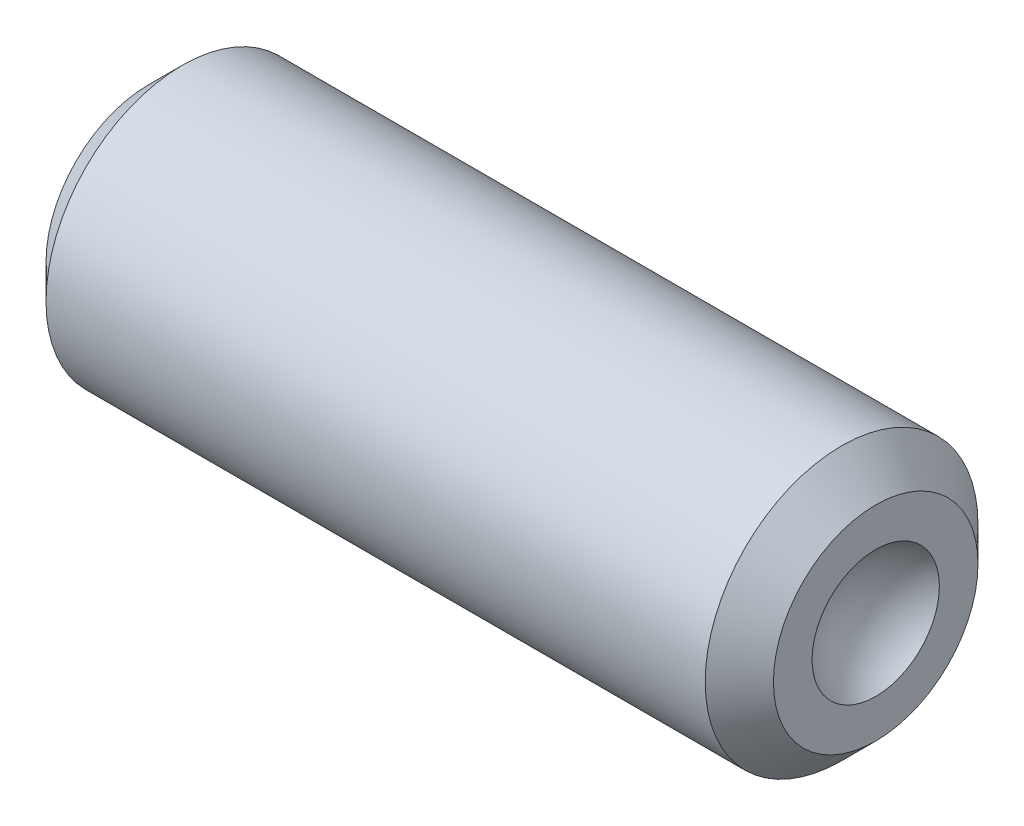
ISO-10303-21;
HEADER;
FILE_DESCRIPTION(('STEP AP214'),'2;1');
FILE_NAME('part.step','',(''),(''),'','','');
FILE_SCHEMA(('AUTOMOTIVE_DESIGN { 1 0 10303 214 1 1 1 1 }'));
ENDSEC;
DATA;
#1=APPLICATION_CONTEXT('core data for automotive mechanical design processes');
#2=APPLICATION_PROTOCOL_DEFINITION('international standard','automotive_design',2000,#1);
#3=PRODUCT_CONTEXT('',#1,'mechanical');
#4=PRODUCT('Part','Part','',(#3));
#5=PRODUCT_RELATED_PRODUCT_CATEGORY('part','',(#4));
#6=PRODUCT_DEFINITION_FORMATION('','',#4);
#7=PRODUCT_DEFINITION_CONTEXT('part definition',#1,'design');
#8=PRODUCT_DEFINITION('design','',#6,#7);
#9=PRODUCT_DEFINITION_SHAPE('','',#8);
#10=(LENGTH_UNIT() NAMED_UNIT(*) SI_UNIT(.MILLI.,.METRE.));
#11=(NAMED_UNIT(*) PLANE_ANGLE_UNIT() SI_UNIT($,.RADIAN.));
#12=(NAMED_UNIT(*) SI_UNIT($,.STERADIAN.) SOLID_ANGLE_UNIT());
#13=UNCERTAINTY_MEASURE_WITH_UNIT(LENGTH_MEASURE(1.E-05),#10,'distance_accuracy_value','');
#14=(GEOMETRIC_REPRESENTATION_CONTEXT(3) GLOBAL_UNCERTAINTY_ASSIGNED_CONTEXT((#13)) GLOBAL_UNIT_ASSIGNED_CONTEXT((#10,
#11,#12)) REPRESENTATION_CONTEXT('',''));
#15=CARTESIAN_POINT('',(0.,0.,0.));
#16=DIRECTION('',(0.,0.,1.));
#17=DIRECTION('',(1.,0.,0.));
#18=AXIS2_PLACEMENT_3D('',#15,#16,#17);
#19=CARTESIAN_POINT('',(0.,0.,0.));
#20=DIRECTION('',(1.,0.,0.));
#21=DIRECTION('',(0.,1.,0.));
#22=AXIS2_PLACEMENT_3D('',#19,#20,#21);
#23=PLANE('',#22);
#24=DIRECTION('',(0.,-0.5,-0.866025403784439));
#25=VECTOR('',#24,1.);
#26=CARTESIAN_POINT('',(0.,0.866025403784439,0.));
#27=LINE('',#26,#25);
#28=CARTESIAN_POINT('',(0.,0.866025403784439,0.));
#29=VERTEX_POINT('',#28);
#30=CARTESIAN_POINT('',(0.,0.43301270189222,-0.75));
#31=VERTEX_POINT('',#30);
#32=EDGE_CURVE('E107',#29,#31,#27,.T.);
#33=ORIENTED_EDGE('',*,*,#32,.F.);
#34=DIRECTION('',(0.,0.5,-0.866025403784439));
#35=VECTOR('',#34,1.);
#36=CARTESIAN_POINT('',(0.,0.433012701892219,0.75));
#37=LINE('',#36,#35);
#38=CARTESIAN_POINT('',(0.,0.433012701892219,0.75));
#39=VERTEX_POINT('',#38);
#40=EDGE_CURVE('E49',#39,#29,#37,.T.);
#41=ORIENTED_EDGE('',*,*,#40,.F.);
#42=DIRECTION('',(0.,1.,0.));
#43=VECTOR('',#42,1.);
#44=CARTESIAN_POINT('',(0.,-0.43301270189222,0.75));
#45=LINE('',#44,#43);
#46=CARTESIAN_POINT('',(0.,-0.43301270189222,0.75));
#47=VERTEX_POINT('',#46);
#48=EDGE_CURVE('E122',#47,#39,#45,.T.);
#49=ORIENTED_EDGE('',*,*,#48,.F.);
#50=DIRECTION('',(0.,0.5,0.866025403784439));
#51=VECTOR('',#50,1.);
#52=CARTESIAN_POINT('',(0.,-0.866025403784439,0.));
#53=LINE('',#52,#51);
#54=CARTESIAN_POINT('',(0.,-0.866025403784439,0.));
#55=VERTEX_POINT('',#54);
#56=EDGE_CURVE('E116',#55,#47,#53,.T.);
#57=ORIENTED_EDGE('',*,*,#56,.F.);
#58=DIRECTION('',(0.,-0.5,0.866025403784439));
#59=VECTOR('',#58,1.);
#60=CARTESIAN_POINT('',(0.,-0.433012701892219,-0.75));
#61=LINE('',#60,#59);
#62=CARTESIAN_POINT('',(0.,-0.433012701892219,-0.75));
#63=VERTEX_POINT('',#62);
#64=EDGE_CURVE('E114',#63,#55,#61,.T.);
#65=ORIENTED_EDGE('',*,*,#64,.F.);
#66=DIRECTION('',(0.,-1.,0.));
#67=VECTOR('',#66,1.);
#68=CARTESIAN_POINT('',(0.,0.43301270189222,-0.75));
#69=LINE('',#68,#67);
#70=EDGE_CURVE('E100',#31,#63,#69,.T.);
#71=ORIENTED_EDGE('',*,*,#70,.F.);
#72=EDGE_LOOP('',(#33,#41,#49,#57,#65,#71));
#73=FACE_BOUND('',#72,.T.);
#74=CARTESIAN_POINT('',(0.,0.,0.));
#75=DIRECTION('',(-1.,0.,0.));
#76=DIRECTION('',(0.,-1.,0.));
#77=AXIS2_PLACEMENT_3D('',#74,#75,#76);
#78=CIRCLE('',#77,1.125);
#79=CARTESIAN_POINT('',(0.,-1.125,0.));
#80=VERTEX_POINT('',#79);
#81=EDGE_CURVE('E12',#80,#80,#78,.T.);
#82=ORIENTED_EDGE('',*,*,#81,.T.);
#83=EDGE_LOOP('',(#82));
#84=FACE_BOUND('',#83,.T.);
#85=ADVANCED_FACE('F35',(#73,#84),#23,.F.);
#86=CARTESIAN_POINT('',(0.375000000000001,0.,0.));
#87=DIRECTION('',(1.,0.,0.));
#88=DIRECTION('',(0.,1.,0.));
#89=AXIS2_PLACEMENT_3D('',#86,#87,#88);
#90=CONICAL_SURFACE('',#89,1.5,0.785398163397447);
#91=ORIENTED_EDGE('',*,*,#81,.F.);
#92=EDGE_LOOP('',(#91));
#93=FACE_BOUND('',#92,.T.);
#94=CARTESIAN_POINT('',(0.375000000000001,0.,0.));
#95=DIRECTION('',(-1.,0.,0.));
#96=DIRECTION('',(0.,-1.,0.));
#97=AXIS2_PLACEMENT_3D('',#94,#95,#96);
#98=CIRCLE('',#97,1.5);
#99=CARTESIAN_POINT('',(0.375000000000001,-1.5,0.));
#100=VERTEX_POINT('',#99);
#101=EDGE_CURVE('E42',#100,#100,#98,.T.);
#102=ORIENTED_EDGE('',*,*,#101,.T.);
#103=EDGE_LOOP('',(#102));
#104=FACE_BOUND('',#103,.T.);
#105=ADVANCED_FACE('F145',(#93,#104),#90,.T.);
#106=CARTESIAN_POINT('',(0.,0.,0.));
#107=DIRECTION('',(-1.,0.,0.));
#108=DIRECTION('',(0.,-1.,0.));
#109=AXIS2_PLACEMENT_3D('',#106,#107,#108);
#110=CYLINDRICAL_SURFACE('',#109,1.5);
#111=ORIENTED_EDGE('',*,*,#101,.F.);
#112=EDGE_LOOP('',(#111));
#113=FACE_BOUND('',#112,.T.);
#114=CARTESIAN_POINT('',(7.625,0.,0.));
#115=DIRECTION('',(-1.,0.,0.));
#116=DIRECTION('',(0.,-1.,0.));
#117=AXIS2_PLACEMENT_3D('',#114,#115,#116);
#118=CIRCLE('',#117,1.5);
#119=CARTESIAN_POINT('',(7.625,-1.5,0.));
#120=VERTEX_POINT('',#119);
#121=EDGE_CURVE('E140',#120,#120,#118,.T.);
#122=ORIENTED_EDGE('',*,*,#121,.T.);
#123=EDGE_LOOP('',(#122));
#124=FACE_BOUND('',#123,.T.);
#125=ADVANCED_FACE('F147',(#113,#124),#110,.T.);
#126=CARTESIAN_POINT('',(8.,0.,0.));
#127=DIRECTION('',(-1.,0.,0.));
#128=DIRECTION('',(0.,-1.,0.));
#129=AXIS2_PLACEMENT_3D('',#126,#127,#128);
#130=CONICAL_SURFACE('',#129,1.125,0.78539816339745);
#131=ORIENTED_EDGE('',*,*,#121,.F.);
#132=EDGE_LOOP('',(#131));
#133=FACE_BOUND('',#132,.T.);
#134=CARTESIAN_POINT('',(8.,0.,0.));
#135=DIRECTION('',(-1.,0.,0.));
#136=DIRECTION('',(0.,-1.,0.));
#137=AXIS2_PLACEMENT_3D('',#134,#135,#136);
#138=CIRCLE('',#137,1.125);
#139=CARTESIAN_POINT('',(8.,-1.125,0.));
#140=VERTEX_POINT('',#139);
#141=EDGE_CURVE('E137',#140,#140,#138,.T.);
#142=ORIENTED_EDGE('',*,*,#141,.T.);
#143=EDGE_LOOP('',(#142));
#144=FACE_BOUND('',#143,.T.);
#145=ADVANCED_FACE('F150',(#133,#144),#130,.T.);
#146=CARTESIAN_POINT('',(8.,1.125,0.));
#147=DIRECTION('',(-1.,0.,0.));
#148=DIRECTION('',(0.,-1.,0.));
#149=AXIS2_PLACEMENT_3D('',#146,#147,#148);
#150=PLANE('',#149);
#151=ORIENTED_EDGE('',*,*,#141,.F.);
#152=EDGE_LOOP('',(#151));
#153=FACE_BOUND('',#152,.T.);
#154=CARTESIAN_POINT('',(8.,0.,0.));
#155=DIRECTION('',(-1.,0.,0.));
#156=DIRECTION('',(0.,-1.,0.));
#157=AXIS2_PLACEMENT_3D('',#154,#155,#156);
#158=CIRCLE('',#157,0.7);
#159=CARTESIAN_POINT('',(8.,-0.7,0.));
#160=VERTEX_POINT('',#159);
#161=EDGE_CURVE('E134',#160,#160,#158,.T.);
#162=ORIENTED_EDGE('',*,*,#161,.T.);
#163=EDGE_LOOP('',(#162));
#164=FACE_BOUND('',#163,.T.);
#165=ADVANCED_FACE('F156',(#153,#164),#150,.F.);
#166=CARTESIAN_POINT('',(8.46583333333333,0.,0.));
#167=DIRECTION('',(-1.,0.,0.));
#168=DIRECTION('',(0.,-1.,0.));
#169=AXIS2_PLACEMENT_3D('',#166,#167,#168);
#170=SPHERICAL_SURFACE('',#169,0.840833333333333);
#171=ORIENTED_EDGE('',*,*,#161,.F.);
#172=EDGE_LOOP('',(#171));
#173=FACE_BOUND('',#172,.T.);
#174=ADVANCED_FACE('F162',(#173),#170,.F.);
#175=CARTESIAN_POINT('',(10.2912878474779,0.433012701892219,0.75));
#176=DIRECTION('',(0.,0.866025403784438,0.5));
#177=DIRECTION('',(0.,-0.5,0.866025403784439));
#178=AXIS2_PLACEMENT_3D('',#175,#176,#177);
#179=PLANE('',#178);
#180=DIRECTION('',(0.,-0.5,0.866025403784439));
#181=VECTOR('',#180,1.);
#182=CARTESIAN_POINT('',(6.,0.433012701892219,0.75));
#183=LINE('',#182,#181);
#184=CARTESIAN_POINT('',(6.,0.866025403784439,0.));
#185=VERTEX_POINT('',#184);
#186=CARTESIAN_POINT('',(6.,0.433012701892219,0.75));
#187=VERTEX_POINT('',#186);
#188=EDGE_CURVE('E68',#185,#187,#183,.T.);
#189=ORIENTED_EDGE('',*,*,#188,.T.);
#190=DIRECTION('',(-1.,0.,0.));
#191=VECTOR('',#190,1.);
#192=CARTESIAN_POINT('',(10.2912878474779,0.433012701892219,0.75));
#193=LINE('',#192,#191);
#194=EDGE_CURVE('E125',#187,#39,#193,.T.);
#195=ORIENTED_EDGE('',*,*,#194,.T.);
#196=ORIENTED_EDGE('',*,*,#40,.T.);
#197=DIRECTION('',(-1.,0.,0.));
#198=VECTOR('',#197,1.);
#199=CARTESIAN_POINT('',(10.2912878474779,0.866025403784439,0.));
#200=LINE('',#199,#198);
#201=EDGE_CURVE('E104',#185,#29,#200,.T.);
#202=ORIENTED_EDGE('',*,*,#201,.F.);
#203=EDGE_LOOP('',(#189,#195,#196,#202));
#204=FACE_BOUND('',#203,.T.);
#205=ADVANCED_FACE('F167',(#204),#179,.F.);
#206=CARTESIAN_POINT('',(10.2912878474779,-0.43301270189222,0.75));
#207=DIRECTION('',(0.,0.,1.));
#208=DIRECTION('',(0.,-1.,0.));
#209=AXIS2_PLACEMENT_3D('',#206,#207,#208);
#210=PLANE('',#209);
#211=DIRECTION('',(0.,-1.,0.));
#212=VECTOR('',#211,1.);
#213=CARTESIAN_POINT('',(6.,-0.43301270189222,0.75));
#214=LINE('',#213,#212);
#215=CARTESIAN_POINT('',(6.,-0.43301270189222,0.75));
#216=VERTEX_POINT('',#215);
#217=EDGE_CURVE('E267',#187,#216,#214,.T.);
#218=ORIENTED_EDGE('',*,*,#217,.T.);
#219=DIRECTION('',(-1.,0.,0.));
#220=VECTOR('',#219,1.);
#221=CARTESIAN_POINT('',(10.2912878474779,-0.43301270189222,0.75));
#222=LINE('',#221,#220);
#223=EDGE_CURVE('E127',#216,#47,#222,.T.);
#224=ORIENTED_EDGE('',*,*,#223,.T.);
#225=ORIENTED_EDGE('',*,*,#48,.T.);
#226=ORIENTED_EDGE('',*,*,#194,.F.);
#227=EDGE_LOOP('',(#218,#224,#225,#226));
#228=FACE_BOUND('',#227,.T.);
#229=ADVANCED_FACE('F172',(#228),#210,.F.);
#230=CARTESIAN_POINT('',(10.2912878474779,-0.866025403784439,0.));
#231=DIRECTION('',(0.,-0.866025403784439,0.5));
#232=DIRECTION('',(0.,-0.5,-0.866025403784439));
#233=AXIS2_PLACEMENT_3D('',#230,#231,#232);
#234=PLANE('',#233);
#235=DIRECTION('',(0.,-0.5,-0.866025403784439));
#236=VECTOR('',#235,1.);
#237=CARTESIAN_POINT('',(6.,-0.866025403784439,0.));
#238=LINE('',#237,#236);
#239=CARTESIAN_POINT('',(6.,-0.866025403784439,0.));
#240=VERTEX_POINT('',#239);
#241=EDGE_CURVE('E270',#216,#240,#238,.T.);
#242=ORIENTED_EDGE('',*,*,#241,.T.);
#243=DIRECTION('',(-1.,0.,0.));
#244=VECTOR('',#243,1.);
#245=CARTESIAN_POINT('',(10.2912878474779,-0.866025403784439,0.));
#246=LINE('',#245,#244);
#247=EDGE_CURVE('E129',#240,#55,#246,.T.);
#248=ORIENTED_EDGE('',*,*,#247,.T.);
#249=ORIENTED_EDGE('',*,*,#56,.T.);
#250=ORIENTED_EDGE('',*,*,#223,.F.);
#251=EDGE_LOOP('',(#242,#248,#249,#250));
#252=FACE_BOUND('',#251,.T.);
#253=ADVANCED_FACE('F217',(#252),#234,.F.);
#254=CARTESIAN_POINT('',(10.2912878474779,-0.433012701892219,-0.75));
#255=DIRECTION('',(0.,-0.866025403784439,-0.5));
#256=DIRECTION('',(0.,0.5,-0.866025403784439));
#257=AXIS2_PLACEMENT_3D('',#254,#255,#256);
#258=PLANE('',#257);
#259=DIRECTION('',(0.,0.5,-0.866025403784439));
#260=VECTOR('',#259,1.);
#261=CARTESIAN_POINT('',(6.,-0.433012701892219,-0.75));
#262=LINE('',#261,#260);
#263=CARTESIAN_POINT('',(6.,-0.433012701892219,-0.75));
#264=VERTEX_POINT('',#263);
#265=EDGE_CURVE('E58',#240,#264,#262,.T.);
#266=ORIENTED_EDGE('',*,*,#265,.T.);
#267=DIRECTION('',(-1.,0.,0.));
#268=VECTOR('',#267,1.);
#269=CARTESIAN_POINT('',(10.2912878474779,-0.433012701892219,-0.75));
#270=LINE('',#269,#268);
#271=EDGE_CURVE('E103',#264,#63,#270,.T.);
#272=ORIENTED_EDGE('',*,*,#271,.T.);
#273=ORIENTED_EDGE('',*,*,#64,.T.);
#274=ORIENTED_EDGE('',*,*,#247,.F.);
#275=EDGE_LOOP('',(#266,#272,#273,#274));
#276=FACE_BOUND('',#275,.T.);
#277=ADVANCED_FACE('F227',(#276),#258,.F.);
#278=CARTESIAN_POINT('',(10.2912878474779,0.43301270189222,-0.75));
#279=DIRECTION('',(0.,0.,-1.));
#280=DIRECTION('',(-1.,0.,0.));
#281=AXIS2_PLACEMENT_3D('',#278,#279,#280);
#282=PLANE('',#281);
#283=DIRECTION('',(0.,1.,0.));
#284=VECTOR('',#283,1.);
#285=CARTESIAN_POINT('',(6.,0.43301270189222,-0.75));
#286=LINE('',#285,#284);
#287=CARTESIAN_POINT('',(6.,0.43301270189222,-0.75));
#288=VERTEX_POINT('',#287);
#289=EDGE_CURVE('E102',#264,#288,#286,.T.);
#290=ORIENTED_EDGE('',*,*,#289,.T.);
#291=DIRECTION('',(-1.,0.,0.));
#292=VECTOR('',#291,1.);
#293=CARTESIAN_POINT('',(10.2912878474779,0.43301270189222,-0.75));
#294=LINE('',#293,#292);
#295=EDGE_CURVE('E95',#288,#31,#294,.T.);
#296=ORIENTED_EDGE('',*,*,#295,.T.);
#297=ORIENTED_EDGE('',*,*,#70,.T.);
#298=ORIENTED_EDGE('',*,*,#271,.F.);
#299=EDGE_LOOP('',(#290,#296,#297,#298));
#300=FACE_BOUND('',#299,.T.);
#301=ADVANCED_FACE('F97',(#300),#282,.F.);
#302=CARTESIAN_POINT('',(10.2912878474779,0.866025403784439,0.));
#303=DIRECTION('',(0.,0.866025403784439,-0.5));
#304=DIRECTION('',(0.,0.5,0.866025403784439));
#305=AXIS2_PLACEMENT_3D('',#302,#303,#304);
#306=PLANE('',#305);
#307=DIRECTION('',(0.,0.5,0.866025403784439));
#308=VECTOR('',#307,1.);
#309=CARTESIAN_POINT('',(6.,0.866025403784439,0.));
#310=LINE('',#309,#308);
#311=EDGE_CURVE('E77',#288,#185,#310,.T.);
#312=ORIENTED_EDGE('',*,*,#311,.T.);
#313=ORIENTED_EDGE('',*,*,#201,.T.);
#314=ORIENTED_EDGE('',*,*,#32,.T.);
#315=ORIENTED_EDGE('',*,*,#295,.F.);
#316=EDGE_LOOP('',(#312,#313,#314,#315));
#317=FACE_BOUND('',#316,.T.);
#318=ADVANCED_FACE('F108',(#317),#306,.F.);
#319=CARTESIAN_POINT('',(6.,1.125,0.));
#320=DIRECTION('',(-1.,0.,0.));
#321=DIRECTION('',(0.,-1.,0.));
#322=AXIS2_PLACEMENT_3D('',#319,#320,#321);
#323=PLANE('',#322);
#324=ORIENTED_EDGE('',*,*,#188,.F.);
#325=ORIENTED_EDGE('',*,*,#311,.F.);
#326=ORIENTED_EDGE('',*,*,#289,.F.);
#327=ORIENTED_EDGE('',*,*,#265,.F.);
#328=ORIENTED_EDGE('',*,*,#241,.F.);
#329=ORIENTED_EDGE('',*,*,#217,.F.);
#330=EDGE_LOOP('',(#324,#325,#326,#327,#328,#329));
#331=FACE_BOUND('',#330,.T.);
#332=ADVANCED_FACE('F253',(#331),#323,.T.);
#333=CLOSED_SHELL('',(#85,#105,#125,#145,#165,#174,#205,#229,#253,#277,#301,#318,#332));
#334=MANIFOLD_SOLID_BREP('B2',#333);
#335=ADVANCED_BREP_SHAPE_REPRESENTATION('',(#18,#334),#14);
#336=SHAPE_DEFINITION_REPRESENTATION(#9,#335);
ENDSEC;
END-ISO-10303-21;
